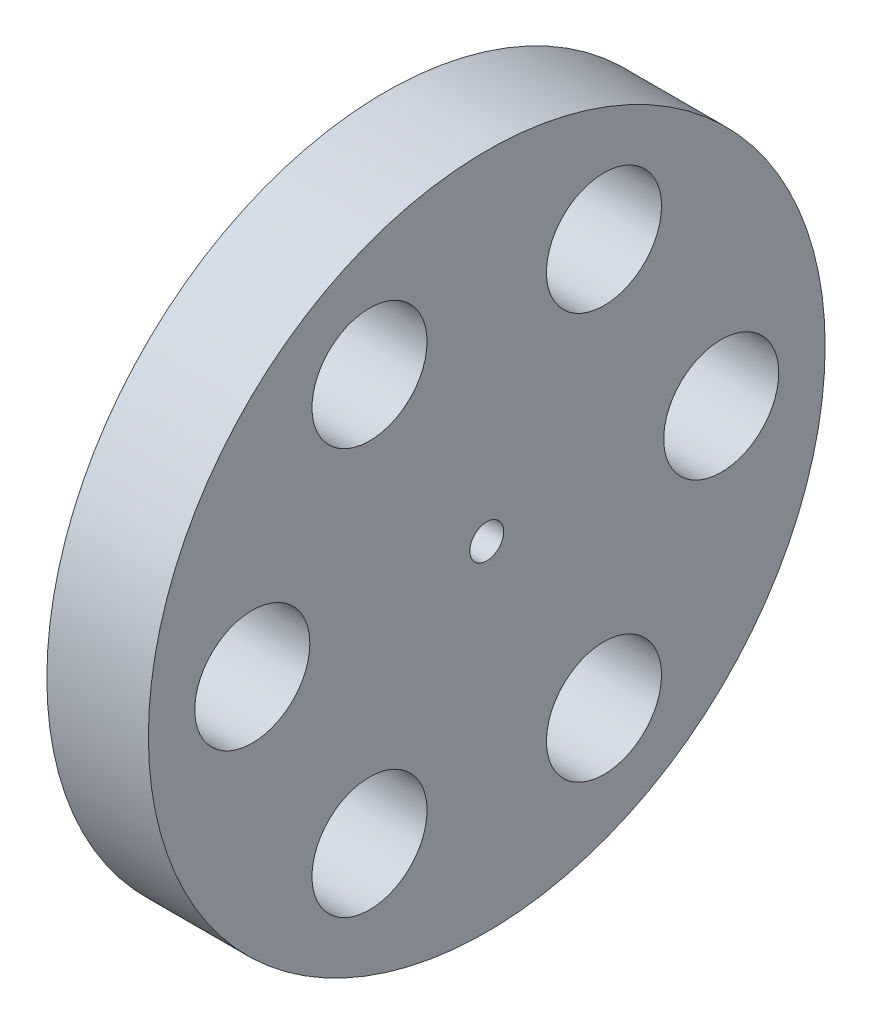
ISO-10303-21;
HEADER;
FILE_DESCRIPTION(('STEP AP214'),'2;1');
FILE_NAME('part.step','',(''),(''),'','','');
FILE_SCHEMA(('AUTOMOTIVE_DESIGN { 1 0 10303 214 1 1 1 1 }'));
ENDSEC;
DATA;
#1=APPLICATION_CONTEXT('core data for automotive mechanical design processes');
#2=APPLICATION_PROTOCOL_DEFINITION('international standard','automotive_design',2000,#1);
#3=PRODUCT_CONTEXT('',#1,'mechanical');
#4=PRODUCT('Part','Part','',(#3));
#5=PRODUCT_RELATED_PRODUCT_CATEGORY('part','',(#4));
#6=PRODUCT_DEFINITION_FORMATION('','',#4);
#7=PRODUCT_DEFINITION_CONTEXT('part definition',#1,'design');
#8=PRODUCT_DEFINITION('design','',#6,#7);
#9=PRODUCT_DEFINITION_SHAPE('','',#8);
#10=(LENGTH_UNIT() NAMED_UNIT(*) SI_UNIT(.MILLI.,.METRE.));
#11=(NAMED_UNIT(*) PLANE_ANGLE_UNIT() SI_UNIT($,.RADIAN.));
#12=(NAMED_UNIT(*) SI_UNIT($,.STERADIAN.) SOLID_ANGLE_UNIT());
#13=UNCERTAINTY_MEASURE_WITH_UNIT(LENGTH_MEASURE(1.E-05),#10,'distance_accuracy_value','');
#14=(GEOMETRIC_REPRESENTATION_CONTEXT(3) GLOBAL_UNCERTAINTY_ASSIGNED_CONTEXT((#13)) GLOBAL_UNIT_ASSIGNED_CONTEXT((#10,
#11,#12)) REPRESENTATION_CONTEXT('',''));
#15=CARTESIAN_POINT('',(0.,0.,0.));
#16=DIRECTION('',(0.,0.,1.));
#17=DIRECTION('',(1.,0.,0.));
#18=AXIS2_PLACEMENT_3D('',#15,#16,#17);
#19=CARTESIAN_POINT('',(15.,0.,0.));
#20=DIRECTION('',(-1.,0.,0.));
#21=DIRECTION('',(0.,0.,1.));
#22=AXIS2_PLACEMENT_3D('',#19,#20,#21);
#23=CYLINDRICAL_SURFACE('',#22,50.);
#24=CARTESIAN_POINT('',(15.,0.,0.));
#25=DIRECTION('',(1.,0.,0.));
#26=DIRECTION('',(0.,0.,-1.));
#27=AXIS2_PLACEMENT_3D('',#24,#25,#26);
#28=CIRCLE('',#27,50.);
#29=CARTESIAN_POINT('',(15.,0.,-50.));
#30=VERTEX_POINT('',#29);
#31=EDGE_CURVE('E45',#30,#30,#28,.T.);
#32=ORIENTED_EDGE('',*,*,#31,.F.);
#33=EDGE_LOOP('',(#32));
#34=FACE_BOUND('',#33,.T.);
#35=CARTESIAN_POINT('',(0.,0.,0.));
#36=DIRECTION('',(1.,0.,0.));
#37=DIRECTION('',(0.,0.,-1.));
#38=AXIS2_PLACEMENT_3D('',#35,#36,#37);
#39=CIRCLE('',#38,50.);
#40=CARTESIAN_POINT('',(0.,0.,-50.));
#41=VERTEX_POINT('',#40);
#42=EDGE_CURVE('E71',#41,#41,#39,.T.);
#43=ORIENTED_EDGE('',*,*,#42,.T.);
#44=EDGE_LOOP('',(#43));
#45=FACE_BOUND('',#44,.T.);
#46=ADVANCED_FACE('F37',(#34,#45),#23,.T.);
#47=CARTESIAN_POINT('',(15.,0.,34.6410161513775));
#48=DIRECTION('',(-1.,0.,0.));
#49=DIRECTION('',(0.,0.,1.));
#50=AXIS2_PLACEMENT_3D('',#47,#48,#49);
#51=CYLINDRICAL_SURFACE('',#50,8.5);
#52=CARTESIAN_POINT('',(15.,0.,34.6410161513775));
#53=DIRECTION('',(1.,0.,0.));
#54=DIRECTION('',(0.,0.,-1.));
#55=AXIS2_PLACEMENT_3D('',#52,#53,#54);
#56=CIRCLE('',#55,8.5);
#57=CARTESIAN_POINT('',(15.,0.,26.1410161513775));
#58=VERTEX_POINT('',#57);
#59=EDGE_CURVE('E50',#58,#58,#56,.T.);
#60=ORIENTED_EDGE('',*,*,#59,.T.);
#61=EDGE_LOOP('',(#60));
#62=FACE_BOUND('',#61,.T.);
#63=CARTESIAN_POINT('',(0.,0.,34.6410161513775));
#64=DIRECTION('',(1.,0.,0.));
#65=DIRECTION('',(0.,0.,-1.));
#66=AXIS2_PLACEMENT_3D('',#63,#64,#65);
#67=CIRCLE('',#66,8.5);
#68=CARTESIAN_POINT('',(0.,0.,26.1410161513775));
#69=VERTEX_POINT('',#68);
#70=EDGE_CURVE('E69',#69,#69,#67,.T.);
#71=ORIENTED_EDGE('',*,*,#70,.F.);
#72=EDGE_LOOP('',(#71));
#73=FACE_BOUND('',#72,.T.);
#74=ADVANCED_FACE('F98',(#62,#73),#51,.F.);
#75=CARTESIAN_POINT('',(15.,-30.,17.3205080756888));
#76=DIRECTION('',(-1.,0.,0.));
#77=DIRECTION('',(0.,0.,1.));
#78=AXIS2_PLACEMENT_3D('',#75,#76,#77);
#79=CYLINDRICAL_SURFACE('',#78,8.5);
#80=CARTESIAN_POINT('',(15.,-30.,17.3205080756888));
#81=DIRECTION('',(1.,0.,0.));
#82=DIRECTION('',(0.,0.,-1.));
#83=AXIS2_PLACEMENT_3D('',#80,#81,#82);
#84=CIRCLE('',#83,8.5);
#85=CARTESIAN_POINT('',(15.,-30.,8.82050807568877));
#86=VERTEX_POINT('',#85);
#87=EDGE_CURVE('E93',#86,#86,#84,.T.);
#88=ORIENTED_EDGE('',*,*,#87,.T.);
#89=EDGE_LOOP('',(#88));
#90=FACE_BOUND('',#89,.T.);
#91=CARTESIAN_POINT('',(0.,-30.,17.3205080756888));
#92=DIRECTION('',(1.,0.,0.));
#93=DIRECTION('',(0.,0.,-1.));
#94=AXIS2_PLACEMENT_3D('',#91,#92,#93);
#95=CIRCLE('',#94,8.5);
#96=CARTESIAN_POINT('',(0.,-30.,8.82050807568877));
#97=VERTEX_POINT('',#96);
#98=EDGE_CURVE('E66',#97,#97,#95,.T.);
#99=ORIENTED_EDGE('',*,*,#98,.F.);
#100=EDGE_LOOP('',(#99));
#101=FACE_BOUND('',#100,.T.);
#102=ADVANCED_FACE('F116',(#90,#101),#79,.F.);
#103=CARTESIAN_POINT('',(15.,-30.,-17.3205080756888));
#104=DIRECTION('',(-1.,0.,0.));
#105=DIRECTION('',(0.,0.,1.));
#106=AXIS2_PLACEMENT_3D('',#103,#104,#105);
#107=CYLINDRICAL_SURFACE('',#106,8.5);
#108=CARTESIAN_POINT('',(15.,-30.,-17.3205080756888));
#109=DIRECTION('',(1.,0.,0.));
#110=DIRECTION('',(0.,0.,-1.));
#111=AXIS2_PLACEMENT_3D('',#108,#109,#110);
#112=CIRCLE('',#111,8.5);
#113=CARTESIAN_POINT('',(15.,-30.,-25.8205080756888));
#114=VERTEX_POINT('',#113);
#115=EDGE_CURVE('E90',#114,#114,#112,.T.);
#116=ORIENTED_EDGE('',*,*,#115,.T.);
#117=EDGE_LOOP('',(#116));
#118=FACE_BOUND('',#117,.T.);
#119=CARTESIAN_POINT('',(0.,-30.,-17.3205080756888));
#120=DIRECTION('',(1.,0.,0.));
#121=DIRECTION('',(0.,0.,-1.));
#122=AXIS2_PLACEMENT_3D('',#119,#120,#121);
#123=CIRCLE('',#122,8.5);
#124=CARTESIAN_POINT('',(0.,-30.,-25.8205080756888));
#125=VERTEX_POINT('',#124);
#126=EDGE_CURVE('E63',#125,#125,#123,.T.);
#127=ORIENTED_EDGE('',*,*,#126,.F.);
#128=EDGE_LOOP('',(#127));
#129=FACE_BOUND('',#128,.T.);
#130=ADVANCED_FACE('F123',(#118,#129),#107,.F.);
#131=CARTESIAN_POINT('',(15.,0.,-34.6410161513775));
#132=DIRECTION('',(-1.,0.,0.));
#133=DIRECTION('',(0.,0.,1.));
#134=AXIS2_PLACEMENT_3D('',#131,#132,#133);
#135=CYLINDRICAL_SURFACE('',#134,8.5);
#136=CARTESIAN_POINT('',(15.,0.,-34.6410161513775));
#137=DIRECTION('',(1.,0.,0.));
#138=DIRECTION('',(0.,0.,-1.));
#139=AXIS2_PLACEMENT_3D('',#136,#137,#138);
#140=CIRCLE('',#139,8.5);
#141=CARTESIAN_POINT('',(15.,0.,-43.1410161513775));
#142=VERTEX_POINT('',#141);
#143=EDGE_CURVE('E85',#142,#142,#140,.T.);
#144=ORIENTED_EDGE('',*,*,#143,.T.);
#145=EDGE_LOOP('',(#144));
#146=FACE_BOUND('',#145,.T.);
#147=CARTESIAN_POINT('',(0.,0.,-34.6410161513775));
#148=DIRECTION('',(1.,0.,0.));
#149=DIRECTION('',(0.,0.,-1.));
#150=AXIS2_PLACEMENT_3D('',#147,#148,#149);
#151=CIRCLE('',#150,8.5);
#152=CARTESIAN_POINT('',(0.,0.,-43.1410161513775));
#153=VERTEX_POINT('',#152);
#154=EDGE_CURVE('E60',#153,#153,#151,.T.);
#155=ORIENTED_EDGE('',*,*,#154,.F.);
#156=EDGE_LOOP('',(#155));
#157=FACE_BOUND('',#156,.T.);
#158=ADVANCED_FACE('F127',(#146,#157),#135,.F.);
#159=CARTESIAN_POINT('',(15.,30.,-17.3205080756888));
#160=DIRECTION('',(-1.,0.,0.));
#161=DIRECTION('',(0.,0.,1.));
#162=AXIS2_PLACEMENT_3D('',#159,#160,#161);
#163=CYLINDRICAL_SURFACE('',#162,8.5);
#164=CARTESIAN_POINT('',(15.,30.,-17.3205080756888));
#165=DIRECTION('',(1.,0.,0.));
#166=DIRECTION('',(0.,0.,-1.));
#167=AXIS2_PLACEMENT_3D('',#164,#165,#166);
#168=CIRCLE('',#167,8.5);
#169=CARTESIAN_POINT('',(15.,30.,-25.8205080756888));
#170=VERTEX_POINT('',#169);
#171=EDGE_CURVE('E80',#170,#170,#168,.T.);
#172=ORIENTED_EDGE('',*,*,#171,.T.);
#173=EDGE_LOOP('',(#172));
#174=FACE_BOUND('',#173,.T.);
#175=CARTESIAN_POINT('',(0.,30.,-17.3205080756888));
#176=DIRECTION('',(1.,0.,0.));
#177=DIRECTION('',(0.,0.,-1.));
#178=AXIS2_PLACEMENT_3D('',#175,#176,#177);
#179=CIRCLE('',#178,8.5);
#180=CARTESIAN_POINT('',(0.,30.,-25.8205080756888));
#181=VERTEX_POINT('',#180);
#182=EDGE_CURVE('E57',#181,#181,#179,.T.);
#183=ORIENTED_EDGE('',*,*,#182,.F.);
#184=EDGE_LOOP('',(#183));
#185=FACE_BOUND('',#184,.T.);
#186=ADVANCED_FACE('F130',(#174,#185),#163,.F.);
#187=CARTESIAN_POINT('',(15.,30.,17.3205080756888));
#188=DIRECTION('',(-1.,0.,0.));
#189=DIRECTION('',(0.,0.,1.));
#190=AXIS2_PLACEMENT_3D('',#187,#188,#189);
#191=CYLINDRICAL_SURFACE('',#190,8.5);
#192=CARTESIAN_POINT('',(15.,30.,17.3205080756888));
#193=DIRECTION('',(1.,0.,0.));
#194=DIRECTION('',(0.,0.,-1.));
#195=AXIS2_PLACEMENT_3D('',#192,#193,#194);
#196=CIRCLE('',#195,8.5);
#197=CARTESIAN_POINT('',(15.,30.,8.82050807568876));
#198=VERTEX_POINT('',#197);
#199=EDGE_CURVE('E76',#198,#198,#196,.T.);
#200=ORIENTED_EDGE('',*,*,#199,.T.);
#201=EDGE_LOOP('',(#200));
#202=FACE_BOUND('',#201,.T.);
#203=CARTESIAN_POINT('',(0.,30.,17.3205080756888));
#204=DIRECTION('',(1.,0.,0.));
#205=DIRECTION('',(0.,0.,-1.));
#206=AXIS2_PLACEMENT_3D('',#203,#204,#205);
#207=CIRCLE('',#206,8.5);
#208=CARTESIAN_POINT('',(0.,30.,8.82050807568876));
#209=VERTEX_POINT('',#208);
#210=EDGE_CURVE('E54',#209,#209,#207,.T.);
#211=ORIENTED_EDGE('',*,*,#210,.F.);
#212=EDGE_LOOP('',(#211));
#213=FACE_BOUND('',#212,.T.);
#214=ADVANCED_FACE('F39',(#202,#213),#191,.F.);
#215=CARTESIAN_POINT('',(15.,0.,0.));
#216=DIRECTION('',(-1.,0.,0.));
#217=DIRECTION('',(0.,0.,1.));
#218=AXIS2_PLACEMENT_3D('',#215,#216,#217);
#219=CYLINDRICAL_SURFACE('',#218,2.5);
#220=CARTESIAN_POINT('',(15.,0.,0.));
#221=DIRECTION('',(1.,0.,0.));
#222=DIRECTION('',(0.,0.,-1.));
#223=AXIS2_PLACEMENT_3D('',#220,#221,#222);
#224=CIRCLE('',#223,2.5);
#225=CARTESIAN_POINT('',(15.,0.,-2.5));
#226=VERTEX_POINT('',#225);
#227=EDGE_CURVE('E10',#226,#226,#224,.T.);
#228=ORIENTED_EDGE('',*,*,#227,.T.);
#229=EDGE_LOOP('',(#228));
#230=FACE_BOUND('',#229,.T.);
#231=CARTESIAN_POINT('',(0.,0.,0.));
#232=DIRECTION('',(1.,0.,0.));
#233=DIRECTION('',(0.,0.,-1.));
#234=AXIS2_PLACEMENT_3D('',#231,#232,#233);
#235=CIRCLE('',#234,2.5);
#236=CARTESIAN_POINT('',(0.,0.,-2.5));
#237=VERTEX_POINT('',#236);
#238=EDGE_CURVE('E41',#237,#237,#235,.T.);
#239=ORIENTED_EDGE('',*,*,#238,.F.);
#240=EDGE_LOOP('',(#239));
#241=FACE_BOUND('',#240,.T.);
#242=ADVANCED_FACE('F105',(#230,#241),#219,.F.);
#243=CARTESIAN_POINT('',(15.,0.,0.));
#244=DIRECTION('',(1.,0.,0.));
#245=DIRECTION('',(0.,0.,-1.));
#246=AXIS2_PLACEMENT_3D('',#243,#244,#245);
#247=PLANE('',#246);
#248=ORIENTED_EDGE('',*,*,#199,.F.);
#249=EDGE_LOOP('',(#248));
#250=FACE_BOUND('',#249,.T.);
#251=ORIENTED_EDGE('',*,*,#171,.F.);
#252=EDGE_LOOP('',(#251));
#253=FACE_BOUND('',#252,.T.);
#254=ORIENTED_EDGE('',*,*,#143,.F.);
#255=EDGE_LOOP('',(#254));
#256=FACE_BOUND('',#255,.T.);
#257=ORIENTED_EDGE('',*,*,#115,.F.);
#258=EDGE_LOOP('',(#257));
#259=FACE_BOUND('',#258,.T.);
#260=ORIENTED_EDGE('',*,*,#87,.F.);
#261=EDGE_LOOP('',(#260));
#262=FACE_BOUND('',#261,.T.);
#263=ORIENTED_EDGE('',*,*,#59,.F.);
#264=EDGE_LOOP('',(#263));
#265=FACE_BOUND('',#264,.T.);
#266=ORIENTED_EDGE('',*,*,#31,.T.);
#267=EDGE_LOOP('',(#266));
#268=FACE_BOUND('',#267,.T.);
#269=ORIENTED_EDGE('',*,*,#227,.F.);
#270=EDGE_LOOP('',(#269));
#271=FACE_BOUND('',#270,.T.);
#272=ADVANCED_FACE('F101',(#250,#253,#256,#259,#262,#265,#268,#271),#247,.T.);
#273=CARTESIAN_POINT('',(0.,0.,0.));
#274=DIRECTION('',(1.,0.,0.));
#275=DIRECTION('',(0.,0.,-1.));
#276=AXIS2_PLACEMENT_3D('',#273,#274,#275);
#277=PLANE('',#276);
#278=ORIENTED_EDGE('',*,*,#210,.T.);
#279=EDGE_LOOP('',(#278));
#280=FACE_BOUND('',#279,.T.);
#281=ORIENTED_EDGE('',*,*,#182,.T.);
#282=EDGE_LOOP('',(#281));
#283=FACE_BOUND('',#282,.T.);
#284=ORIENTED_EDGE('',*,*,#154,.T.);
#285=EDGE_LOOP('',(#284));
#286=FACE_BOUND('',#285,.T.);
#287=ORIENTED_EDGE('',*,*,#126,.T.);
#288=EDGE_LOOP('',(#287));
#289=FACE_BOUND('',#288,.T.);
#290=ORIENTED_EDGE('',*,*,#98,.T.);
#291=EDGE_LOOP('',(#290));
#292=FACE_BOUND('',#291,.T.);
#293=ORIENTED_EDGE('',*,*,#70,.T.);
#294=EDGE_LOOP('',(#293));
#295=FACE_BOUND('',#294,.T.);
#296=ORIENTED_EDGE('',*,*,#42,.F.);
#297=EDGE_LOOP('',(#296));
#298=FACE_BOUND('',#297,.T.);
#299=ORIENTED_EDGE('',*,*,#238,.T.);
#300=EDGE_LOOP('',(#299));
#301=FACE_BOUND('',#300,.T.);
#302=ADVANCED_FACE('F104',(#280,#283,#286,#289,#292,#295,#298,#301),#277,.F.);
#303=CLOSED_SHELL('',(#46,#74,#102,#130,#158,#186,#214,#242,#272,#302));
#304=MANIFOLD_SOLID_BREP('B2',#303);
#305=ADVANCED_BREP_SHAPE_REPRESENTATION('',(#18,#304),#14);
#306=SHAPE_DEFINITION_REPRESENTATION(#9,#305);
ENDSEC;
END-ISO-10303-21;
